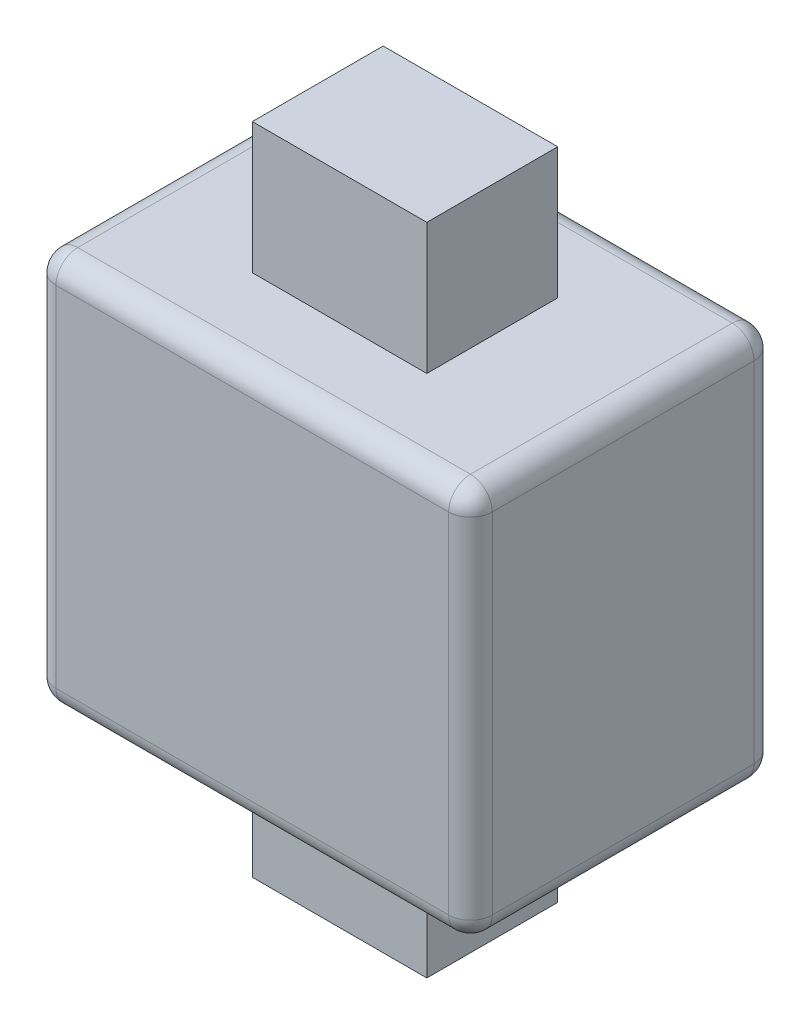
ISO-10303-21;
HEADER;
FILE_DESCRIPTION(('STEP AP214'),'2;1');
FILE_NAME('part.step','',(''),(''),'','','');
FILE_SCHEMA(('AUTOMOTIVE_DESIGN { 1 0 10303 214 1 1 1 1 }'));
ENDSEC;
DATA;
#1=APPLICATION_CONTEXT('core data for automotive mechanical design processes');
#2=APPLICATION_PROTOCOL_DEFINITION('international standard','automotive_design',2000,#1);
#3=PRODUCT_CONTEXT('',#1,'mechanical');
#4=PRODUCT('Part','Part','',(#3));
#5=PRODUCT_RELATED_PRODUCT_CATEGORY('part','',(#4));
#6=PRODUCT_DEFINITION_FORMATION('','',#4);
#7=PRODUCT_DEFINITION_CONTEXT('part definition',#1,'design');
#8=PRODUCT_DEFINITION('design','',#6,#7);
#9=PRODUCT_DEFINITION_SHAPE('','',#8);
#10=(LENGTH_UNIT() NAMED_UNIT(*) SI_UNIT(.MILLI.,.METRE.));
#11=(NAMED_UNIT(*) PLANE_ANGLE_UNIT() SI_UNIT($,.RADIAN.));
#12=(NAMED_UNIT(*) SI_UNIT($,.STERADIAN.) SOLID_ANGLE_UNIT());
#13=UNCERTAINTY_MEASURE_WITH_UNIT(LENGTH_MEASURE(1.E-05),#10,'distance_accuracy_value','');
#14=(GEOMETRIC_REPRESENTATION_CONTEXT(3) GLOBAL_UNCERTAINTY_ASSIGNED_CONTEXT((#13)) GLOBAL_UNIT_ASSIGNED_CONTEXT((#10,
#11,#12)) REPRESENTATION_CONTEXT('',''));
#15=CARTESIAN_POINT('',(0.,0.,0.));
#16=DIRECTION('',(0.,0.,1.));
#17=DIRECTION('',(1.,0.,0.));
#18=AXIS2_PLACEMENT_3D('',#15,#16,#17);
#19=CARTESIAN_POINT('',(2.5,2.25,3.5));
#20=DIRECTION('',(-1.,0.,0.));
#21=DIRECTION('',(0.,0.,1.));
#22=AXIS2_PLACEMENT_3D('',#19,#20,#21);
#23=PLANE('',#22);
#24=DIRECTION('',(0.,1.,0.));
#25=VECTOR('',#24,1.);
#26=CARTESIAN_POINT('',(2.5,-2.25,3.25));
#27=LINE('',#26,#25);
#28=CARTESIAN_POINT('',(2.5,2.,3.25));
#29=VERTEX_POINT('',#28);
#30=CARTESIAN_POINT('',(2.5,-2.,3.25));
#31=VERTEX_POINT('',#30);
#32=EDGE_CURVE('E282',#29,#31,#27,.F.);
#33=ORIENTED_EDGE('',*,*,#32,.T.);
#34=DIRECTION('',(0.,0.,-1.));
#35=VECTOR('',#34,1.);
#36=CARTESIAN_POINT('',(2.5,-2.,3.5));
#37=LINE('',#36,#35);
#38=CARTESIAN_POINT('',(2.5,-2.,0.25));
#39=VERTEX_POINT('',#38);
#40=EDGE_CURVE('E286',#31,#39,#37,.T.);
#41=ORIENTED_EDGE('',*,*,#40,.T.);
#42=DIRECTION('',(0.,1.,0.));
#43=VECTOR('',#42,1.);
#44=CARTESIAN_POINT('',(2.5,2.25,0.25));
#45=LINE('',#44,#43);
#46=CARTESIAN_POINT('',(2.5,2.,0.25));
#47=VERTEX_POINT('',#46);
#48=EDGE_CURVE('E284',#39,#47,#45,.T.);
#49=ORIENTED_EDGE('',*,*,#48,.T.);
#50=DIRECTION('',(0.,0.,-1.));
#51=VECTOR('',#50,1.);
#52=CARTESIAN_POINT('',(2.5,2.,3.5));
#53=LINE('',#52,#51);
#54=EDGE_CURVE('E280',#47,#29,#53,.F.);
#55=ORIENTED_EDGE('',*,*,#54,.T.);
#56=EDGE_LOOP('',(#33,#41,#49,#55));
#57=FACE_BOUND('',#56,.T.);
#58=ADVANCED_FACE('F40',(#57),#23,.F.);
#59=CARTESIAN_POINT('',(-2.5,2.25,3.5));
#60=DIRECTION('',(0.,-1.,0.));
#61=DIRECTION('',(0.,0.,-1.));
#62=AXIS2_PLACEMENT_3D('',#59,#60,#61);
#63=PLANE('',#62);
#64=DIRECTION('',(0.,0.,-1.));
#65=VECTOR('',#64,1.);
#66=CARTESIAN_POINT('',(2.25,2.25,3.5));
#67=LINE('',#66,#65);
#68=CARTESIAN_POINT('',(2.25,2.25,3.25));
#69=VERTEX_POINT('',#68);
#70=CARTESIAN_POINT('',(2.25,2.25,0.25));
#71=VERTEX_POINT('',#70);
#72=EDGE_CURVE('E64',#69,#71,#67,.T.);
#73=ORIENTED_EDGE('',*,*,#72,.T.);
#74=DIRECTION('',(-1.,0.,0.));
#75=VECTOR('',#74,1.);
#76=CARTESIAN_POINT('',(-2.5,2.25,0.25));
#77=LINE('',#76,#75);
#78=CARTESIAN_POINT('',(-2.25,2.25,0.25));
#79=VERTEX_POINT('',#78);
#80=EDGE_CURVE('E11',#71,#79,#77,.T.);
#81=ORIENTED_EDGE('',*,*,#80,.T.);
#82=DIRECTION('',(0.,0.,-1.));
#83=VECTOR('',#82,1.);
#84=CARTESIAN_POINT('',(-2.25,2.25,3.5));
#85=LINE('',#84,#83);
#86=CARTESIAN_POINT('',(-2.25,2.25,3.25));
#87=VERTEX_POINT('',#86);
#88=EDGE_CURVE('E49',#79,#87,#85,.F.);
#89=ORIENTED_EDGE('',*,*,#88,.T.);
#90=DIRECTION('',(-1.,0.,0.));
#91=VECTOR('',#90,1.);
#92=CARTESIAN_POINT('',(2.5,2.25,3.25));
#93=LINE('',#92,#91);
#94=EDGE_CURVE('E298',#87,#69,#93,.F.);
#95=ORIENTED_EDGE('',*,*,#94,.T.);
#96=EDGE_LOOP('',(#73,#81,#89,#95));
#97=FACE_BOUND('',#96,.T.);
#98=DIRECTION('',(-1.,0.,0.));
#99=VECTOR('',#98,1.);
#100=CARTESIAN_POINT('',(0.,2.25,2.5));
#101=LINE('',#100,#99);
#102=CARTESIAN_POINT('',(1.,2.25,2.5));
#103=VERTEX_POINT('',#102);
#104=CARTESIAN_POINT('',(-1.,2.25,2.5));
#105=VERTEX_POINT('',#104);
#106=EDGE_CURVE('E237',#103,#105,#101,.T.);
#107=ORIENTED_EDGE('',*,*,#106,.T.);
#108=DIRECTION('',(0.,0.,-1.));
#109=VECTOR('',#108,1.);
#110=CARTESIAN_POINT('',(-0.999999999999999,2.25,0.));
#111=LINE('',#110,#109);
#112=CARTESIAN_POINT('',(-1.,2.25,1.));
#113=VERTEX_POINT('',#112);
#114=EDGE_CURVE('E191',#105,#113,#111,.T.);
#115=ORIENTED_EDGE('',*,*,#114,.T.);
#116=DIRECTION('',(-1.,0.,0.));
#117=VECTOR('',#116,1.);
#118=CARTESIAN_POINT('',(0.,2.25,1.));
#119=LINE('',#118,#117);
#120=CARTESIAN_POINT('',(1.,2.25,1.));
#121=VERTEX_POINT('',#120);
#122=EDGE_CURVE('E227',#121,#113,#119,.T.);
#123=ORIENTED_EDGE('',*,*,#122,.F.);
#124=DIRECTION('',(0.,0.,-1.));
#125=VECTOR('',#124,1.);
#126=CARTESIAN_POINT('',(1.,2.25,0.));
#127=LINE('',#126,#125);
#128=EDGE_CURVE('E240',#103,#121,#127,.T.);
#129=ORIENTED_EDGE('',*,*,#128,.F.);
#130=EDGE_LOOP('',(#107,#115,#123,#129));
#131=FACE_BOUND('',#130,.T.);
#132=ADVANCED_FACE('F409',(#97,#131),#63,.F.);
#133=CARTESIAN_POINT('',(-2.5,2.25,3.5));
#134=DIRECTION('',(1.,0.,0.));
#135=DIRECTION('',(0.,1.,0.));
#136=AXIS2_PLACEMENT_3D('',#133,#134,#135);
#137=PLANE('',#136);
#138=DIRECTION('',(0.,-1.,0.));
#139=VECTOR('',#138,1.);
#140=CARTESIAN_POINT('',(-2.5,2.25,0.25));
#141=LINE('',#140,#139);
#142=CARTESIAN_POINT('',(-2.5,2.,0.25));
#143=VERTEX_POINT('',#142);
#144=CARTESIAN_POINT('',(-2.5,-2.,0.25));
#145=VERTEX_POINT('',#144);
#146=EDGE_CURVE('E266',#143,#145,#141,.T.);
#147=ORIENTED_EDGE('',*,*,#146,.T.);
#148=DIRECTION('',(0.,0.,-1.));
#149=VECTOR('',#148,1.);
#150=CARTESIAN_POINT('',(-2.5,-2.,3.5));
#151=LINE('',#150,#149);
#152=CARTESIAN_POINT('',(-2.5,-2.,3.25));
#153=VERTEX_POINT('',#152);
#154=EDGE_CURVE('E268',#145,#153,#151,.F.);
#155=ORIENTED_EDGE('',*,*,#154,.T.);
#156=DIRECTION('',(0.,-1.,0.));
#157=VECTOR('',#156,1.);
#158=CARTESIAN_POINT('',(-2.5,2.25,3.25));
#159=LINE('',#158,#157);
#160=CARTESIAN_POINT('',(-2.5,2.,3.25));
#161=VERTEX_POINT('',#160);
#162=EDGE_CURVE('E264',#153,#161,#159,.F.);
#163=ORIENTED_EDGE('',*,*,#162,.T.);
#164=DIRECTION('',(0.,0.,-1.));
#165=VECTOR('',#164,1.);
#166=CARTESIAN_POINT('',(-2.5,2.,3.5));
#167=LINE('',#166,#165);
#168=EDGE_CURVE('E262',#161,#143,#167,.T.);
#169=ORIENTED_EDGE('',*,*,#168,.T.);
#170=EDGE_LOOP('',(#147,#155,#163,#169));
#171=FACE_BOUND('',#170,.T.);
#172=ADVANCED_FACE('F445',(#171),#137,.F.);
#173=CARTESIAN_POINT('',(-2.5,-2.25,3.5));
#174=DIRECTION('',(0.,1.,0.));
#175=DIRECTION('',(0.,0.,1.));
#176=AXIS2_PLACEMENT_3D('',#173,#174,#175);
#177=PLANE('',#176);
#178=DIRECTION('',(1.,0.,0.));
#179=VECTOR('',#178,1.);
#180=CARTESIAN_POINT('',(-2.5,-2.25,3.25));
#181=LINE('',#180,#179);
#182=CARTESIAN_POINT('',(2.25,-2.25,3.25));
#183=VERTEX_POINT('',#182);
#184=CARTESIAN_POINT('',(-2.25,-2.25,3.25));
#185=VERTEX_POINT('',#184);
#186=EDGE_CURVE('E257',#183,#185,#181,.F.);
#187=ORIENTED_EDGE('',*,*,#186,.T.);
#188=DIRECTION('',(0.,0.,-1.));
#189=VECTOR('',#188,1.);
#190=CARTESIAN_POINT('',(-2.25,-2.25,3.5));
#191=LINE('',#190,#189);
#192=CARTESIAN_POINT('',(-2.25,-2.25,0.25));
#193=VERTEX_POINT('',#192);
#194=EDGE_CURVE('E259',#185,#193,#191,.T.);
#195=ORIENTED_EDGE('',*,*,#194,.T.);
#196=DIRECTION('',(1.,0.,0.));
#197=VECTOR('',#196,1.);
#198=CARTESIAN_POINT('',(-2.5,-2.25,0.25));
#199=LINE('',#198,#197);
#200=CARTESIAN_POINT('',(2.25,-2.25,0.25));
#201=VERTEX_POINT('',#200);
#202=EDGE_CURVE('E253',#193,#201,#199,.T.);
#203=ORIENTED_EDGE('',*,*,#202,.T.);
#204=DIRECTION('',(0.,0.,-1.));
#205=VECTOR('',#204,1.);
#206=CARTESIAN_POINT('',(2.25,-2.25,3.5));
#207=LINE('',#206,#205);
#208=EDGE_CURVE('E255',#201,#183,#207,.F.);
#209=ORIENTED_EDGE('',*,*,#208,.T.);
#210=EDGE_LOOP('',(#187,#195,#203,#209));
#211=FACE_BOUND('',#210,.T.);
#212=DIRECTION('',(1.,0.,0.));
#213=VECTOR('',#212,1.);
#214=CARTESIAN_POINT('',(0.,-2.25,2.5));
#215=LINE('',#214,#213);
#216=CARTESIAN_POINT('',(-1.,-2.25,2.5));
#217=VERTEX_POINT('',#216);
#218=CARTESIAN_POINT('',(1.,-2.25,2.5));
#219=VERTEX_POINT('',#218);
#220=EDGE_CURVE('E212',#217,#219,#215,.T.);
#221=ORIENTED_EDGE('',*,*,#220,.T.);
#222=DIRECTION('',(0.,0.,-1.));
#223=VECTOR('',#222,1.);
#224=CARTESIAN_POINT('',(1.,-2.25,0.));
#225=LINE('',#224,#223);
#226=CARTESIAN_POINT('',(1.,-2.25,1.));
#227=VERTEX_POINT('',#226);
#228=EDGE_CURVE('E186',#219,#227,#225,.T.);
#229=ORIENTED_EDGE('',*,*,#228,.T.);
#230=DIRECTION('',(1.,0.,0.));
#231=VECTOR('',#230,1.);
#232=CARTESIAN_POINT('',(0.,-2.25,1.));
#233=LINE('',#232,#231);
#234=CARTESIAN_POINT('',(-1.,-2.25,0.999999999999999));
#235=VERTEX_POINT('',#234);
#236=EDGE_CURVE('E201',#235,#227,#233,.T.);
#237=ORIENTED_EDGE('',*,*,#236,.F.);
#238=DIRECTION('',(0.,0.,-1.));
#239=VECTOR('',#238,1.);
#240=CARTESIAN_POINT('',(-1.,-2.25,0.));
#241=LINE('',#240,#239);
#242=EDGE_CURVE('E214',#217,#235,#241,.T.);
#243=ORIENTED_EDGE('',*,*,#242,.F.);
#244=EDGE_LOOP('',(#221,#229,#237,#243));
#245=FACE_BOUND('',#244,.T.);
#246=ADVANCED_FACE('F662',(#211,#245),#177,.F.);
#247=CARTESIAN_POINT('',(0.,0.,3.5));
#248=DIRECTION('',(0.,0.,1.));
#249=DIRECTION('',(1.,0.,0.));
#250=AXIS2_PLACEMENT_3D('',#247,#248,#249);
#251=PLANE('',#250);
#252=DIRECTION('',(0.,-1.,0.));
#253=VECTOR('',#252,1.);
#254=CARTESIAN_POINT('',(-2.25,-2.25,3.5));
#255=LINE('',#254,#253);
#256=CARTESIAN_POINT('',(-2.25,2.,3.5));
#257=VERTEX_POINT('',#256);
#258=CARTESIAN_POINT('',(-2.25,-2.,3.5));
#259=VERTEX_POINT('',#258);
#260=EDGE_CURVE('E273',#257,#259,#255,.T.);
#261=ORIENTED_EDGE('',*,*,#260,.T.);
#262=DIRECTION('',(1.,0.,0.));
#263=VECTOR('',#262,1.);
#264=CARTESIAN_POINT('',(2.5,-2.,3.5));
#265=LINE('',#264,#263);
#266=CARTESIAN_POINT('',(2.25,-2.,3.5));
#267=VERTEX_POINT('',#266);
#268=EDGE_CURVE('E277',#259,#267,#265,.T.);
#269=ORIENTED_EDGE('',*,*,#268,.T.);
#270=DIRECTION('',(0.,1.,0.));
#271=VECTOR('',#270,1.);
#272=CARTESIAN_POINT('',(2.25,2.25,3.5));
#273=LINE('',#272,#271);
#274=CARTESIAN_POINT('',(2.25,2.,3.5));
#275=VERTEX_POINT('',#274);
#276=EDGE_CURVE('E275',#267,#275,#273,.T.);
#277=ORIENTED_EDGE('',*,*,#276,.T.);
#278=DIRECTION('',(-1.,0.,0.));
#279=VECTOR('',#278,1.);
#280=CARTESIAN_POINT('',(-2.5,2.,3.5));
#281=LINE('',#280,#279);
#282=EDGE_CURVE('E271',#275,#257,#281,.T.);
#283=ORIENTED_EDGE('',*,*,#282,.T.);
#284=EDGE_LOOP('',(#261,#269,#277,#283));
#285=FACE_BOUND('',#284,.T.);
#286=ADVANCED_FACE('F381',(#285),#251,.T.);
#287=CARTESIAN_POINT('',(0.,0.,0.));
#288=DIRECTION('',(0.,0.,1.));
#289=DIRECTION('',(1.,0.,0.));
#290=AXIS2_PLACEMENT_3D('',#287,#288,#289);
#291=PLANE('',#290);
#292=DIRECTION('',(0.,1.,0.));
#293=VECTOR('',#292,1.);
#294=CARTESIAN_POINT('',(2.25,0.,0.));
#295=LINE('',#294,#293);
#296=CARTESIAN_POINT('',(2.25,2.,0.));
#297=VERTEX_POINT('',#296);
#298=CARTESIAN_POINT('',(2.25,-2.,0.));
#299=VERTEX_POINT('',#298);
#300=EDGE_CURVE('E293',#297,#299,#295,.F.);
#301=ORIENTED_EDGE('',*,*,#300,.T.);
#302=DIRECTION('',(1.,0.,0.));
#303=VECTOR('',#302,1.);
#304=CARTESIAN_POINT('',(0.,-2.,0.));
#305=LINE('',#304,#303);
#306=CARTESIAN_POINT('',(-2.25,-2.,0.));
#307=VERTEX_POINT('',#306);
#308=EDGE_CURVE('E295',#299,#307,#305,.F.);
#309=ORIENTED_EDGE('',*,*,#308,.T.);
#310=DIRECTION('',(0.,-1.,0.));
#311=VECTOR('',#310,1.);
#312=CARTESIAN_POINT('',(-2.25,0.,0.));
#313=LINE('',#312,#311);
#314=CARTESIAN_POINT('',(-2.25,2.,0.));
#315=VERTEX_POINT('',#314);
#316=EDGE_CURVE('E291',#307,#315,#313,.F.);
#317=ORIENTED_EDGE('',*,*,#316,.T.);
#318=DIRECTION('',(-1.,0.,0.));
#319=VECTOR('',#318,1.);
#320=CARTESIAN_POINT('',(0.,2.,0.));
#321=LINE('',#320,#319);
#322=EDGE_CURVE('E289',#315,#297,#321,.F.);
#323=ORIENTED_EDGE('',*,*,#322,.T.);
#324=EDGE_LOOP('',(#301,#309,#317,#323));
#325=FACE_BOUND('',#324,.T.);
#326=ADVANCED_FACE('F679',(#325),#291,.F.);
#327=CARTESIAN_POINT('',(-0.999999999999999,3.75,0.));
#328=DIRECTION('',(-1.,0.,0.));
#329=DIRECTION('',(0.,0.,1.));
#330=AXIS2_PLACEMENT_3D('',#327,#328,#329);
#331=PLANE('',#330);
#332=ORIENTED_EDGE('',*,*,#114,.F.);
#333=DIRECTION('',(0.,-1.,0.));
#334=VECTOR('',#333,1.);
#335=CARTESIAN_POINT('',(-1.,3.75,2.5));
#336=LINE('',#335,#334);
#337=CARTESIAN_POINT('',(-1.,3.75,2.5));
#338=VERTEX_POINT('',#337);
#339=EDGE_CURVE('E250',#338,#105,#336,.T.);
#340=ORIENTED_EDGE('',*,*,#339,.F.);
#341=DIRECTION('',(0.,0.,-1.));
#342=VECTOR('',#341,1.);
#343=CARTESIAN_POINT('',(-0.999999999999999,3.75,0.));
#344=LINE('',#343,#342);
#345=CARTESIAN_POINT('',(-1.,3.75,1.));
#346=VERTEX_POINT('',#345);
#347=EDGE_CURVE('E223',#338,#346,#344,.T.);
#348=ORIENTED_EDGE('',*,*,#347,.T.);
#349=DIRECTION('',(0.,-1.,0.));
#350=VECTOR('',#349,1.);
#351=CARTESIAN_POINT('',(-1.,3.75,1.));
#352=LINE('',#351,#350);
#353=EDGE_CURVE('E234',#346,#113,#352,.T.);
#354=ORIENTED_EDGE('',*,*,#353,.T.);
#355=EDGE_LOOP('',(#332,#340,#348,#354));
#356=FACE_BOUND('',#355,.T.);
#357=ADVANCED_FACE('F687',(#356),#331,.T.);
#358=CARTESIAN_POINT('',(0.,3.75,2.5));
#359=DIRECTION('',(0.,0.,1.));
#360=DIRECTION('',(1.,0.,0.));
#361=AXIS2_PLACEMENT_3D('',#358,#359,#360);
#362=PLANE('',#361);
#363=ORIENTED_EDGE('',*,*,#106,.F.);
#364=DIRECTION('',(0.,-1.,0.));
#365=VECTOR('',#364,1.);
#366=CARTESIAN_POINT('',(1.,3.75,2.5));
#367=LINE('',#366,#365);
#368=CARTESIAN_POINT('',(1.,3.75,2.5));
#369=VERTEX_POINT('',#368);
#370=EDGE_CURVE('E248',#369,#103,#367,.T.);
#371=ORIENTED_EDGE('',*,*,#370,.F.);
#372=DIRECTION('',(-1.,0.,0.));
#373=VECTOR('',#372,1.);
#374=CARTESIAN_POINT('',(0.,3.75,2.5));
#375=LINE('',#374,#373);
#376=EDGE_CURVE('E226',#369,#338,#375,.T.);
#377=ORIENTED_EDGE('',*,*,#376,.T.);
#378=ORIENTED_EDGE('',*,*,#339,.T.);
#379=EDGE_LOOP('',(#363,#371,#377,#378));
#380=FACE_BOUND('',#379,.T.);
#381=ADVANCED_FACE('F700',(#380),#362,.T.);
#382=CARTESIAN_POINT('',(1.,3.75,0.));
#383=DIRECTION('',(-1.,0.,0.));
#384=DIRECTION('',(0.,0.,1.));
#385=AXIS2_PLACEMENT_3D('',#382,#383,#384);
#386=PLANE('',#385);
#387=ORIENTED_EDGE('',*,*,#128,.T.);
#388=DIRECTION('',(0.,-1.,0.));
#389=VECTOR('',#388,1.);
#390=CARTESIAN_POINT('',(1.,3.75,1.));
#391=LINE('',#390,#389);
#392=CARTESIAN_POINT('',(1.,3.75,1.));
#393=VERTEX_POINT('',#392);
#394=EDGE_CURVE('E245',#393,#121,#391,.T.);
#395=ORIENTED_EDGE('',*,*,#394,.F.);
#396=DIRECTION('',(0.,0.,-1.));
#397=VECTOR('',#396,1.);
#398=CARTESIAN_POINT('',(1.,3.75,0.));
#399=LINE('',#398,#397);
#400=EDGE_CURVE('E230',#369,#393,#399,.T.);
#401=ORIENTED_EDGE('',*,*,#400,.F.);
#402=ORIENTED_EDGE('',*,*,#370,.T.);
#403=EDGE_LOOP('',(#387,#395,#401,#402));
#404=FACE_BOUND('',#403,.T.);
#405=ADVANCED_FACE('F709',(#404),#386,.F.);
#406=CARTESIAN_POINT('',(0.,3.75,1.));
#407=DIRECTION('',(0.,0.,1.));
#408=DIRECTION('',(1.,0.,0.));
#409=AXIS2_PLACEMENT_3D('',#406,#407,#408);
#410=PLANE('',#409);
#411=ORIENTED_EDGE('',*,*,#122,.T.);
#412=ORIENTED_EDGE('',*,*,#353,.F.);
#413=DIRECTION('',(-1.,0.,0.));
#414=VECTOR('',#413,1.);
#415=CARTESIAN_POINT('',(0.,3.75,1.));
#416=LINE('',#415,#414);
#417=EDGE_CURVE('E232',#393,#346,#416,.T.);
#418=ORIENTED_EDGE('',*,*,#417,.F.);
#419=ORIENTED_EDGE('',*,*,#394,.T.);
#420=EDGE_LOOP('',(#411,#412,#418,#419));
#421=FACE_BOUND('',#420,.T.);
#422=ADVANCED_FACE('F716',(#421),#410,.F.);
#423=CARTESIAN_POINT('',(0.,3.75,0.));
#424=DIRECTION('',(0.,1.,0.));
#425=DIRECTION('',(0.,0.,1.));
#426=AXIS2_PLACEMENT_3D('',#423,#424,#425);
#427=PLANE('',#426);
#428=ORIENTED_EDGE('',*,*,#347,.F.);
#429=ORIENTED_EDGE('',*,*,#376,.F.);
#430=ORIENTED_EDGE('',*,*,#400,.T.);
#431=ORIENTED_EDGE('',*,*,#417,.T.);
#432=EDGE_LOOP('',(#428,#429,#430,#431));
#433=FACE_BOUND('',#432,.T.);
#434=ADVANCED_FACE('F724',(#433),#427,.T.);
#435=CARTESIAN_POINT('',(1.,-3.75,0.));
#436=DIRECTION('',(1.,0.,0.));
#437=DIRECTION('',(0.,0.,-1.));
#438=AXIS2_PLACEMENT_3D('',#435,#436,#437);
#439=PLANE('',#438);
#440=ORIENTED_EDGE('',*,*,#228,.F.);
#441=DIRECTION('',(0.,1.,0.));
#442=VECTOR('',#441,1.);
#443=CARTESIAN_POINT('',(1.,-3.75,2.5));
#444=LINE('',#443,#442);
#445=CARTESIAN_POINT('',(1.,-3.75,2.5));
#446=VERTEX_POINT('',#445);
#447=EDGE_CURVE('E181',#446,#219,#444,.T.);
#448=ORIENTED_EDGE('',*,*,#447,.F.);
#449=DIRECTION('',(0.,0.,-1.));
#450=VECTOR('',#449,1.);
#451=CARTESIAN_POINT('',(1.,-3.75,0.));
#452=LINE('',#451,#450);
#453=CARTESIAN_POINT('',(1.,-3.75,1.));
#454=VERTEX_POINT('',#453);
#455=EDGE_CURVE('E184',#446,#454,#452,.T.);
#456=ORIENTED_EDGE('',*,*,#455,.T.);
#457=DIRECTION('',(0.,1.,0.));
#458=VECTOR('',#457,1.);
#459=CARTESIAN_POINT('',(1.,-3.75,1.));
#460=LINE('',#459,#458);
#461=EDGE_CURVE('E210',#454,#227,#460,.T.);
#462=ORIENTED_EDGE('',*,*,#461,.T.);
#463=EDGE_LOOP('',(#440,#448,#456,#462));
#464=FACE_BOUND('',#463,.T.);
#465=ADVANCED_FACE('F183',(#464),#439,.T.);
#466=CARTESIAN_POINT('',(0.,-3.75,2.5));
#467=DIRECTION('',(0.,0.,1.));
#468=DIRECTION('',(1.,0.,0.));
#469=AXIS2_PLACEMENT_3D('',#466,#467,#468);
#470=PLANE('',#469);
#471=ORIENTED_EDGE('',*,*,#220,.F.);
#472=DIRECTION('',(0.,1.,0.));
#473=VECTOR('',#472,1.);
#474=CARTESIAN_POINT('',(-1.,-3.75,2.5));
#475=LINE('',#474,#473);
#476=CARTESIAN_POINT('',(-1.,-3.75,2.5));
#477=VERTEX_POINT('',#476);
#478=EDGE_CURVE('E192',#477,#217,#475,.T.);
#479=ORIENTED_EDGE('',*,*,#478,.F.);
#480=DIRECTION('',(1.,0.,0.));
#481=VECTOR('',#480,1.);
#482=CARTESIAN_POINT('',(0.,-3.75,2.5));
#483=LINE('',#482,#481);
#484=EDGE_CURVE('E197',#477,#446,#483,.T.);
#485=ORIENTED_EDGE('',*,*,#484,.T.);
#486=ORIENTED_EDGE('',*,*,#447,.T.);
#487=EDGE_LOOP('',(#471,#479,#485,#486));
#488=FACE_BOUND('',#487,.T.);
#489=ADVANCED_FACE('F203',(#488),#470,.T.);
#490=CARTESIAN_POINT('',(-1.,-3.75,0.));
#491=DIRECTION('',(1.,0.,0.));
#492=DIRECTION('',(0.,0.,-1.));
#493=AXIS2_PLACEMENT_3D('',#490,#491,#492);
#494=PLANE('',#493);
#495=ORIENTED_EDGE('',*,*,#242,.T.);
#496=DIRECTION('',(0.,1.,0.));
#497=VECTOR('',#496,1.);
#498=CARTESIAN_POINT('',(-1.,-3.75,0.999999999999999));
#499=LINE('',#498,#497);
#500=CARTESIAN_POINT('',(-1.,-3.75,0.999999999999999));
#501=VERTEX_POINT('',#500);
#502=EDGE_CURVE('E219',#501,#235,#499,.T.);
#503=ORIENTED_EDGE('',*,*,#502,.F.);
#504=DIRECTION('',(0.,0.,-1.));
#505=VECTOR('',#504,1.);
#506=CARTESIAN_POINT('',(-1.,-3.75,0.));
#507=LINE('',#506,#505);
#508=EDGE_CURVE('E205',#477,#501,#507,.T.);
#509=ORIENTED_EDGE('',*,*,#508,.F.);
#510=ORIENTED_EDGE('',*,*,#478,.T.);
#511=EDGE_LOOP('',(#495,#503,#509,#510));
#512=FACE_BOUND('',#511,.T.);
#513=ADVANCED_FACE('F743',(#512),#494,.F.);
#514=CARTESIAN_POINT('',(0.,-3.75,1.));
#515=DIRECTION('',(0.,0.,1.));
#516=DIRECTION('',(1.,0.,0.));
#517=AXIS2_PLACEMENT_3D('',#514,#515,#516);
#518=PLANE('',#517);
#519=ORIENTED_EDGE('',*,*,#236,.T.);
#520=ORIENTED_EDGE('',*,*,#461,.F.);
#521=DIRECTION('',(1.,0.,0.));
#522=VECTOR('',#521,1.);
#523=CARTESIAN_POINT('',(0.,-3.75,1.));
#524=LINE('',#523,#522);
#525=EDGE_CURVE('E199',#501,#454,#524,.T.);
#526=ORIENTED_EDGE('',*,*,#525,.F.);
#527=ORIENTED_EDGE('',*,*,#502,.T.);
#528=EDGE_LOOP('',(#519,#520,#526,#527));
#529=FACE_BOUND('',#528,.T.);
#530=ADVANCED_FACE('F632',(#529),#518,.F.);
#531=CARTESIAN_POINT('',(0.,-3.75,0.));
#532=DIRECTION('',(0.,-1.,0.));
#533=DIRECTION('',(0.,0.,-1.));
#534=AXIS2_PLACEMENT_3D('',#531,#532,#533);
#535=PLANE('',#534);
#536=ORIENTED_EDGE('',*,*,#455,.F.);
#537=ORIENTED_EDGE('',*,*,#484,.F.);
#538=ORIENTED_EDGE('',*,*,#508,.T.);
#539=ORIENTED_EDGE('',*,*,#525,.T.);
#540=EDGE_LOOP('',(#536,#537,#538,#539));
#541=FACE_BOUND('',#540,.T.);
#542=ADVANCED_FACE('F196',(#541),#535,.T.);
#543=CARTESIAN_POINT('',(2.25,2.,3.5));
#544=DIRECTION('',(0.,0.,-1.));
#545=DIRECTION('',(-1.,0.,0.));
#546=AXIS2_PLACEMENT_3D('',#543,#544,#545);
#547=CYLINDRICAL_SURFACE('',#546,0.25);
#548=CARTESIAN_POINT('',(2.25,2.,3.25));
#549=DIRECTION('',(0.,0.,1.));
#550=DIRECTION('',(1.,0.,0.));
#551=AXIS2_PLACEMENT_3D('',#548,#549,#550);
#552=CIRCLE('',#551,0.25);
#553=EDGE_CURVE('E44',#29,#69,#552,.T.);
#554=ORIENTED_EDGE('',*,*,#553,.F.);
#555=ORIENTED_EDGE('',*,*,#54,.F.);
#556=CARTESIAN_POINT('',(2.25,2.,0.25));
#557=DIRECTION('',(0.,0.,-1.));
#558=DIRECTION('',(-1.,0.,0.));
#559=AXIS2_PLACEMENT_3D('',#556,#557,#558);
#560=CIRCLE('',#559,0.25);
#561=EDGE_CURVE('E359',#71,#47,#560,.T.);
#562=ORIENTED_EDGE('',*,*,#561,.F.);
#563=ORIENTED_EDGE('',*,*,#72,.F.);
#564=EDGE_LOOP('',(#554,#555,#562,#563));
#565=FACE_BOUND('',#564,.T.);
#566=ADVANCED_FACE('F42',(#565),#547,.T.);
#567=CARTESIAN_POINT('',(2.25,2.,3.25));
#568=DIRECTION('',(0.,0.,1.));
#569=DIRECTION('',(1.,0.,0.));
#570=AXIS2_PLACEMENT_3D('',#567,#568,#569);
#571=SPHERICAL_SURFACE('',#570,0.25);
#572=CARTESIAN_POINT('',(2.25,2.,3.25));
#573=DIRECTION('',(0.,1.,0.));
#574=DIRECTION('',(0.,0.,1.));
#575=AXIS2_PLACEMENT_3D('',#572,#573,#574);
#576=CIRCLE('',#575,0.25);
#577=EDGE_CURVE('E354',#29,#275,#576,.F.);
#578=ORIENTED_EDGE('',*,*,#577,.F.);
#579=ORIENTED_EDGE('',*,*,#553,.T.);
#580=CARTESIAN_POINT('',(2.25,2.,3.25));
#581=DIRECTION('',(1.,0.,0.));
#582=DIRECTION('',(0.,0.,-1.));
#583=AXIS2_PLACEMENT_3D('',#580,#581,#582);
#584=CIRCLE('',#583,0.25);
#585=EDGE_CURVE('E357',#275,#69,#584,.F.);
#586=ORIENTED_EDGE('',*,*,#585,.F.);
#587=EDGE_LOOP('',(#578,#579,#586));
#588=FACE_BOUND('',#587,.T.);
#589=ADVANCED_FACE('F369',(#588),#571,.T.);
#590=CARTESIAN_POINT('',(2.25,2.,0.25));
#591=DIRECTION('',(0.,0.,1.));
#592=DIRECTION('',(1.,0.,0.));
#593=AXIS2_PLACEMENT_3D('',#590,#591,#592);
#594=SPHERICAL_SURFACE('',#593,0.25);
#595=CARTESIAN_POINT('',(2.25,2.,0.25));
#596=DIRECTION('',(1.,0.,0.));
#597=DIRECTION('',(0.,1.,0.));
#598=AXIS2_PLACEMENT_3D('',#595,#596,#597);
#599=CIRCLE('',#598,0.25);
#600=EDGE_CURVE('E348',#71,#297,#599,.F.);
#601=ORIENTED_EDGE('',*,*,#600,.F.);
#602=ORIENTED_EDGE('',*,*,#561,.T.);
#603=CARTESIAN_POINT('',(2.25,2.,0.25));
#604=DIRECTION('',(0.,1.,0.));
#605=DIRECTION('',(0.,0.,1.));
#606=AXIS2_PLACEMENT_3D('',#603,#604,#605);
#607=CIRCLE('',#606,0.25);
#608=EDGE_CURVE('E351',#297,#47,#607,.F.);
#609=ORIENTED_EDGE('',*,*,#608,.F.);
#610=EDGE_LOOP('',(#601,#602,#609));
#611=FACE_BOUND('',#610,.T.);
#612=ADVANCED_FACE('F404',(#611),#594,.T.);
#613=CARTESIAN_POINT('',(0.,2.,3.25));
#614=DIRECTION('',(1.,0.,0.));
#615=DIRECTION('',(0.,0.,-1.));
#616=AXIS2_PLACEMENT_3D('',#613,#614,#615);
#617=CYLINDRICAL_SURFACE('',#616,0.25);
#618=ORIENTED_EDGE('',*,*,#585,.T.);
#619=ORIENTED_EDGE('',*,*,#94,.F.);
#620=CARTESIAN_POINT('',(-2.25,2.,3.25));
#621=DIRECTION('',(-1.,0.,0.));
#622=DIRECTION('',(0.,-1.,0.));
#623=AXIS2_PLACEMENT_3D('',#620,#621,#622);
#624=CIRCLE('',#623,0.25);
#625=EDGE_CURVE('E342',#257,#87,#624,.T.);
#626=ORIENTED_EDGE('',*,*,#625,.F.);
#627=ORIENTED_EDGE('',*,*,#282,.F.);
#628=EDGE_LOOP('',(#618,#619,#626,#627));
#629=FACE_BOUND('',#628,.T.);
#630=ADVANCED_FACE('F376',(#629),#617,.T.);
#631=CARTESIAN_POINT('',(2.25,0.,3.25));
#632=DIRECTION('',(0.,-1.,0.));
#633=DIRECTION('',(0.,0.,-1.));
#634=AXIS2_PLACEMENT_3D('',#631,#632,#633);
#635=CYLINDRICAL_SURFACE('',#634,0.25);
#636=ORIENTED_EDGE('',*,*,#577,.T.);
#637=ORIENTED_EDGE('',*,*,#276,.F.);
#638=CARTESIAN_POINT('',(2.25,-2.,3.25));
#639=DIRECTION('',(0.,-1.,0.));
#640=DIRECTION('',(0.,0.,-1.));
#641=AXIS2_PLACEMENT_3D('',#638,#639,#640);
#642=CIRCLE('',#641,0.25);
#643=EDGE_CURVE('E339',#31,#267,#642,.T.);
#644=ORIENTED_EDGE('',*,*,#643,.F.);
#645=ORIENTED_EDGE('',*,*,#32,.F.);
#646=EDGE_LOOP('',(#636,#637,#644,#645));
#647=FACE_BOUND('',#646,.T.);
#648=ADVANCED_FACE('F387',(#647),#635,.T.);
#649=CARTESIAN_POINT('',(2.25,-2.,3.5));
#650=DIRECTION('',(0.,0.,-1.));
#651=DIRECTION('',(-1.,0.,0.));
#652=AXIS2_PLACEMENT_3D('',#649,#650,#651);
#653=CYLINDRICAL_SURFACE('',#652,0.25);
#654=CARTESIAN_POINT('',(2.25,-2.,0.25));
#655=DIRECTION('',(0.,0.,-1.));
#656=DIRECTION('',(-1.,0.,0.));
#657=AXIS2_PLACEMENT_3D('',#654,#655,#656);
#658=CIRCLE('',#657,0.25);
#659=EDGE_CURVE('E333',#39,#201,#658,.T.);
#660=ORIENTED_EDGE('',*,*,#659,.F.);
#661=ORIENTED_EDGE('',*,*,#40,.F.);
#662=CARTESIAN_POINT('',(2.25,-2.,3.25));
#663=DIRECTION('',(0.,0.,1.));
#664=DIRECTION('',(1.,0.,0.));
#665=AXIS2_PLACEMENT_3D('',#662,#663,#664);
#666=CIRCLE('',#665,0.25);
#667=EDGE_CURVE('E336',#183,#31,#666,.T.);
#668=ORIENTED_EDGE('',*,*,#667,.F.);
#669=ORIENTED_EDGE('',*,*,#208,.F.);
#670=EDGE_LOOP('',(#660,#661,#668,#669));
#671=FACE_BOUND('',#670,.T.);
#672=ADVANCED_FACE('F393',(#671),#653,.T.);
#673=CARTESIAN_POINT('',(2.25,2.25,0.25));
#674=DIRECTION('',(0.,1.,0.));
#675=DIRECTION('',(0.,0.,1.));
#676=AXIS2_PLACEMENT_3D('',#673,#674,#675);
#677=CYLINDRICAL_SURFACE('',#676,0.25);
#678=ORIENTED_EDGE('',*,*,#608,.T.);
#679=ORIENTED_EDGE('',*,*,#48,.F.);
#680=CARTESIAN_POINT('',(2.25,-2.,0.25));
#681=DIRECTION('',(0.,-1.,0.));
#682=DIRECTION('',(1.,0.,0.));
#683=AXIS2_PLACEMENT_3D('',#680,#681,#682);
#684=CIRCLE('',#683,0.25);
#685=EDGE_CURVE('E331',#299,#39,#684,.T.);
#686=ORIENTED_EDGE('',*,*,#685,.F.);
#687=ORIENTED_EDGE('',*,*,#300,.F.);
#688=EDGE_LOOP('',(#678,#679,#686,#687));
#689=FACE_BOUND('',#688,.T.);
#690=ADVANCED_FACE('F401',(#689),#677,.T.);
#691=CARTESIAN_POINT('',(-2.5,2.,0.25));
#692=DIRECTION('',(-1.,0.,0.));
#693=DIRECTION('',(0.,0.,1.));
#694=AXIS2_PLACEMENT_3D('',#691,#692,#693);
#695=CYLINDRICAL_SURFACE('',#694,0.25);
#696=ORIENTED_EDGE('',*,*,#600,.T.);
#697=ORIENTED_EDGE('',*,*,#322,.F.);
#698=CARTESIAN_POINT('',(-2.25,2.,0.25));
#699=DIRECTION('',(-1.,0.,0.));
#700=DIRECTION('',(0.,0.,1.));
#701=AXIS2_PLACEMENT_3D('',#698,#699,#700);
#702=CIRCLE('',#701,0.25);
#703=EDGE_CURVE('E329',#79,#315,#702,.T.);
#704=ORIENTED_EDGE('',*,*,#703,.F.);
#705=ORIENTED_EDGE('',*,*,#80,.F.);
#706=EDGE_LOOP('',(#696,#697,#704,#705));
#707=FACE_BOUND('',#706,.T.);
#708=ADVANCED_FACE('F407',(#707),#695,.T.);
#709=CARTESIAN_POINT('',(-2.25,2.,3.5));
#710=DIRECTION('',(0.,0.,-1.));
#711=DIRECTION('',(-1.,0.,0.));
#712=AXIS2_PLACEMENT_3D('',#709,#710,#711);
#713=CYLINDRICAL_SURFACE('',#712,0.25);
#714=CARTESIAN_POINT('',(-2.25,2.,3.25));
#715=DIRECTION('',(0.,0.,1.));
#716=DIRECTION('',(1.,0.,0.));
#717=AXIS2_PLACEMENT_3D('',#714,#715,#716);
#718=CIRCLE('',#717,0.25);
#719=EDGE_CURVE('E345',#87,#161,#718,.T.);
#720=ORIENTED_EDGE('',*,*,#719,.F.);
#721=ORIENTED_EDGE('',*,*,#88,.F.);
#722=CARTESIAN_POINT('',(-2.25,2.,0.25));
#723=DIRECTION('',(0.,0.,-1.));
#724=DIRECTION('',(-1.,0.,0.));
#725=AXIS2_PLACEMENT_3D('',#722,#723,#724);
#726=CIRCLE('',#725,0.25);
#727=EDGE_CURVE('E57',#143,#79,#726,.T.);
#728=ORIENTED_EDGE('',*,*,#727,.F.);
#729=ORIENTED_EDGE('',*,*,#168,.F.);
#730=EDGE_LOOP('',(#720,#721,#728,#729));
#731=FACE_BOUND('',#730,.T.);
#732=ADVANCED_FACE('F412',(#731),#713,.T.);
#733=CARTESIAN_POINT('',(-2.25,2.,3.25));
#734=DIRECTION('',(0.,0.,1.));
#735=DIRECTION('',(1.,0.,0.));
#736=AXIS2_PLACEMENT_3D('',#733,#734,#735);
#737=SPHERICAL_SURFACE('',#736,0.25);
#738=ORIENTED_EDGE('',*,*,#625,.T.);
#739=ORIENTED_EDGE('',*,*,#719,.T.);
#740=CARTESIAN_POINT('',(-2.25,2.,3.25));
#741=DIRECTION('',(0.,1.,0.));
#742=DIRECTION('',(0.,0.,1.));
#743=AXIS2_PLACEMENT_3D('',#740,#741,#742);
#744=CIRCLE('',#743,0.25);
#745=EDGE_CURVE('E325',#257,#161,#744,.F.);
#746=ORIENTED_EDGE('',*,*,#745,.F.);
#747=EDGE_LOOP('',(#738,#739,#746));
#748=FACE_BOUND('',#747,.T.);
#749=ADVANCED_FACE('F415',(#748),#737,.T.);
#750=CARTESIAN_POINT('',(2.25,-2.,3.25));
#751=DIRECTION('',(0.,0.,1.));
#752=DIRECTION('',(1.,0.,0.));
#753=AXIS2_PLACEMENT_3D('',#750,#751,#752);
#754=SPHERICAL_SURFACE('',#753,0.25);
#755=ORIENTED_EDGE('',*,*,#667,.T.);
#756=ORIENTED_EDGE('',*,*,#643,.T.);
#757=CARTESIAN_POINT('',(2.25,-2.,3.25));
#758=DIRECTION('',(1.,0.,0.));
#759=DIRECTION('',(0.,0.,-1.));
#760=AXIS2_PLACEMENT_3D('',#757,#758,#759);
#761=CIRCLE('',#760,0.25);
#762=EDGE_CURVE('E323',#183,#267,#761,.F.);
#763=ORIENTED_EDGE('',*,*,#762,.F.);
#764=EDGE_LOOP('',(#755,#756,#763));
#765=FACE_BOUND('',#764,.T.);
#766=ADVANCED_FACE('F429',(#765),#754,.T.);
#767=CARTESIAN_POINT('',(2.25,-2.,0.25));
#768=DIRECTION('',(0.,0.,1.));
#769=DIRECTION('',(1.,0.,0.));
#770=AXIS2_PLACEMENT_3D('',#767,#768,#769);
#771=SPHERICAL_SURFACE('',#770,0.25);
#772=ORIENTED_EDGE('',*,*,#685,.T.);
#773=ORIENTED_EDGE('',*,*,#659,.T.);
#774=CARTESIAN_POINT('',(2.25,-2.,0.25));
#775=DIRECTION('',(1.,0.,0.));
#776=DIRECTION('',(0.,0.,-1.));
#777=AXIS2_PLACEMENT_3D('',#774,#775,#776);
#778=CIRCLE('',#777,0.25);
#779=EDGE_CURVE('E320',#299,#201,#778,.F.);
#780=ORIENTED_EDGE('',*,*,#779,.F.);
#781=EDGE_LOOP('',(#772,#773,#780));
#782=FACE_BOUND('',#781,.T.);
#783=ADVANCED_FACE('F431',(#782),#771,.T.);
#784=CARTESIAN_POINT('',(-2.25,2.,0.25));
#785=DIRECTION('',(0.,0.,1.));
#786=DIRECTION('',(1.,0.,0.));
#787=AXIS2_PLACEMENT_3D('',#784,#785,#786);
#788=SPHERICAL_SURFACE('',#787,0.25);
#789=ORIENTED_EDGE('',*,*,#727,.T.);
#790=ORIENTED_EDGE('',*,*,#703,.T.);
#791=CARTESIAN_POINT('',(-2.25,2.,0.25));
#792=DIRECTION('',(0.,1.,0.));
#793=DIRECTION('',(0.,0.,1.));
#794=AXIS2_PLACEMENT_3D('',#791,#792,#793);
#795=CIRCLE('',#794,0.25);
#796=EDGE_CURVE('E317',#143,#315,#795,.F.);
#797=ORIENTED_EDGE('',*,*,#796,.F.);
#798=EDGE_LOOP('',(#789,#790,#797));
#799=FACE_BOUND('',#798,.T.);
#800=ADVANCED_FACE('F437',(#799),#788,.T.);
#801=CARTESIAN_POINT('',(-2.25,0.,3.25));
#802=DIRECTION('',(0.,1.,0.));
#803=DIRECTION('',(-1.,0.,0.));
#804=AXIS2_PLACEMENT_3D('',#801,#802,#803);
#805=CYLINDRICAL_SURFACE('',#804,0.25);
#806=ORIENTED_EDGE('',*,*,#745,.T.);
#807=ORIENTED_EDGE('',*,*,#162,.F.);
#808=CARTESIAN_POINT('',(-2.25,-2.,3.25));
#809=DIRECTION('',(0.,-1.,0.));
#810=DIRECTION('',(0.,0.,-1.));
#811=AXIS2_PLACEMENT_3D('',#808,#809,#810);
#812=CIRCLE('',#811,0.25);
#813=EDGE_CURVE('E314',#259,#153,#812,.T.);
#814=ORIENTED_EDGE('',*,*,#813,.F.);
#815=ORIENTED_EDGE('',*,*,#260,.F.);
#816=EDGE_LOOP('',(#806,#807,#814,#815));
#817=FACE_BOUND('',#816,.T.);
#818=ADVANCED_FACE('F419',(#817),#805,.T.);
#819=CARTESIAN_POINT('',(0.,-2.,3.25));
#820=DIRECTION('',(-1.,0.,0.));
#821=DIRECTION('',(0.,0.,1.));
#822=AXIS2_PLACEMENT_3D('',#819,#820,#821);
#823=CYLINDRICAL_SURFACE('',#822,0.25);
#824=ORIENTED_EDGE('',*,*,#762,.T.);
#825=ORIENTED_EDGE('',*,*,#268,.F.);
#826=CARTESIAN_POINT('',(-2.25,-2.,3.25));
#827=DIRECTION('',(-1.,0.,0.));
#828=DIRECTION('',(0.,0.,1.));
#829=AXIS2_PLACEMENT_3D('',#826,#827,#828);
#830=CIRCLE('',#829,0.25);
#831=EDGE_CURVE('E311',#185,#259,#830,.T.);
#832=ORIENTED_EDGE('',*,*,#831,.F.);
#833=ORIENTED_EDGE('',*,*,#186,.F.);
#834=EDGE_LOOP('',(#824,#825,#832,#833));
#835=FACE_BOUND('',#834,.T.);
#836=ADVANCED_FACE('F427',(#835),#823,.T.);
#837=CARTESIAN_POINT('',(-2.5,-2.,0.25));
#838=DIRECTION('',(1.,0.,0.));
#839=DIRECTION('',(0.,0.,-1.));
#840=AXIS2_PLACEMENT_3D('',#837,#838,#839);
#841=CYLINDRICAL_SURFACE('',#840,0.25);
#842=ORIENTED_EDGE('',*,*,#779,.T.);
#843=ORIENTED_EDGE('',*,*,#202,.F.);
#844=CARTESIAN_POINT('',(-2.25,-2.,0.25));
#845=DIRECTION('',(-1.,0.,0.));
#846=DIRECTION('',(0.,0.,1.));
#847=AXIS2_PLACEMENT_3D('',#844,#845,#846);
#848=CIRCLE('',#847,0.25);
#849=EDGE_CURVE('E308',#307,#193,#848,.T.);
#850=ORIENTED_EDGE('',*,*,#849,.F.);
#851=ORIENTED_EDGE('',*,*,#308,.F.);
#852=EDGE_LOOP('',(#842,#843,#850,#851));
#853=FACE_BOUND('',#852,.T.);
#854=ADVANCED_FACE('F462',(#853),#841,.T.);
#855=CARTESIAN_POINT('',(-2.25,2.25,0.25));
#856=DIRECTION('',(0.,-1.,0.));
#857=DIRECTION('',(1.,0.,0.));
#858=AXIS2_PLACEMENT_3D('',#855,#856,#857);
#859=CYLINDRICAL_SURFACE('',#858,0.25);
#860=ORIENTED_EDGE('',*,*,#796,.T.);
#861=ORIENTED_EDGE('',*,*,#316,.F.);
#862=CARTESIAN_POINT('',(-2.25,-2.,0.25));
#863=DIRECTION('',(0.,-1.,0.));
#864=DIRECTION('',(0.,0.,-1.));
#865=AXIS2_PLACEMENT_3D('',#862,#863,#864);
#866=CIRCLE('',#865,0.25);
#867=EDGE_CURVE('E306',#145,#307,#866,.T.);
#868=ORIENTED_EDGE('',*,*,#867,.F.);
#869=ORIENTED_EDGE('',*,*,#146,.F.);
#870=EDGE_LOOP('',(#860,#861,#868,#869));
#871=FACE_BOUND('',#870,.T.);
#872=ADVANCED_FACE('F459',(#871),#859,.T.);
#873=CARTESIAN_POINT('',(-2.25,-2.,3.25));
#874=DIRECTION('',(0.,0.,1.));
#875=DIRECTION('',(1.,0.,0.));
#876=AXIS2_PLACEMENT_3D('',#873,#874,#875);
#877=SPHERICAL_SURFACE('',#876,0.25);
#878=ORIENTED_EDGE('',*,*,#831,.T.);
#879=ORIENTED_EDGE('',*,*,#813,.T.);
#880=CARTESIAN_POINT('',(-2.25,-2.,3.25));
#881=DIRECTION('',(0.,0.,1.));
#882=DIRECTION('',(1.,0.,0.));
#883=AXIS2_PLACEMENT_3D('',#880,#881,#882);
#884=CIRCLE('',#883,0.25);
#885=EDGE_CURVE('E304',#185,#153,#884,.F.);
#886=ORIENTED_EDGE('',*,*,#885,.F.);
#887=EDGE_LOOP('',(#878,#879,#886));
#888=FACE_BOUND('',#887,.T.);
#889=ADVANCED_FACE('F423',(#888),#877,.T.);
#890=CARTESIAN_POINT('',(-2.25,-2.,0.25));
#891=DIRECTION('',(0.,0.,1.));
#892=DIRECTION('',(1.,0.,0.));
#893=AXIS2_PLACEMENT_3D('',#890,#891,#892);
#894=SPHERICAL_SURFACE('',#893,0.25);
#895=ORIENTED_EDGE('',*,*,#867,.T.);
#896=ORIENTED_EDGE('',*,*,#849,.T.);
#897=CARTESIAN_POINT('',(-2.25,-2.,0.25));
#898=DIRECTION('',(0.,0.,-1.));
#899=DIRECTION('',(-1.,0.,0.));
#900=AXIS2_PLACEMENT_3D('',#897,#898,#899);
#901=CIRCLE('',#900,0.25);
#902=EDGE_CURVE('E302',#145,#193,#901,.F.);
#903=ORIENTED_EDGE('',*,*,#902,.F.);
#904=EDGE_LOOP('',(#895,#896,#903));
#905=FACE_BOUND('',#904,.T.);
#906=ADVANCED_FACE('F452',(#905),#894,.T.);
#907=CARTESIAN_POINT('',(-2.25,-2.,3.5));
#908=DIRECTION('',(0.,0.,-1.));
#909=DIRECTION('',(-1.,0.,0.));
#910=AXIS2_PLACEMENT_3D('',#907,#908,#909);
#911=CYLINDRICAL_SURFACE('',#910,0.25);
#912=ORIENTED_EDGE('',*,*,#885,.T.);
#913=ORIENTED_EDGE('',*,*,#154,.F.);
#914=ORIENTED_EDGE('',*,*,#902,.T.);
#915=ORIENTED_EDGE('',*,*,#194,.F.);
#916=EDGE_LOOP('',(#912,#913,#914,#915));
#917=FACE_BOUND('',#916,.T.);
#918=ADVANCED_FACE('F449',(#917),#911,.T.);
#919=CLOSED_SHELL('',(#58,#132,#172,#246,#286,#326,#357,#381,#405,#422,#434,#465,#489,#513,#530,
#542,#566,#589,#612,#630,#648,#672,#690,#708,#732,#749,#766,#783,#800,#818,#836,#854,#872,#889,
#906,#918));
#920=MANIFOLD_SOLID_BREP('B2',#919);
#921=ADVANCED_BREP_SHAPE_REPRESENTATION('',(#18,#920),#14);
#922=SHAPE_DEFINITION_REPRESENTATION(#9,#921);
ENDSEC;
END-ISO-10303-21;
